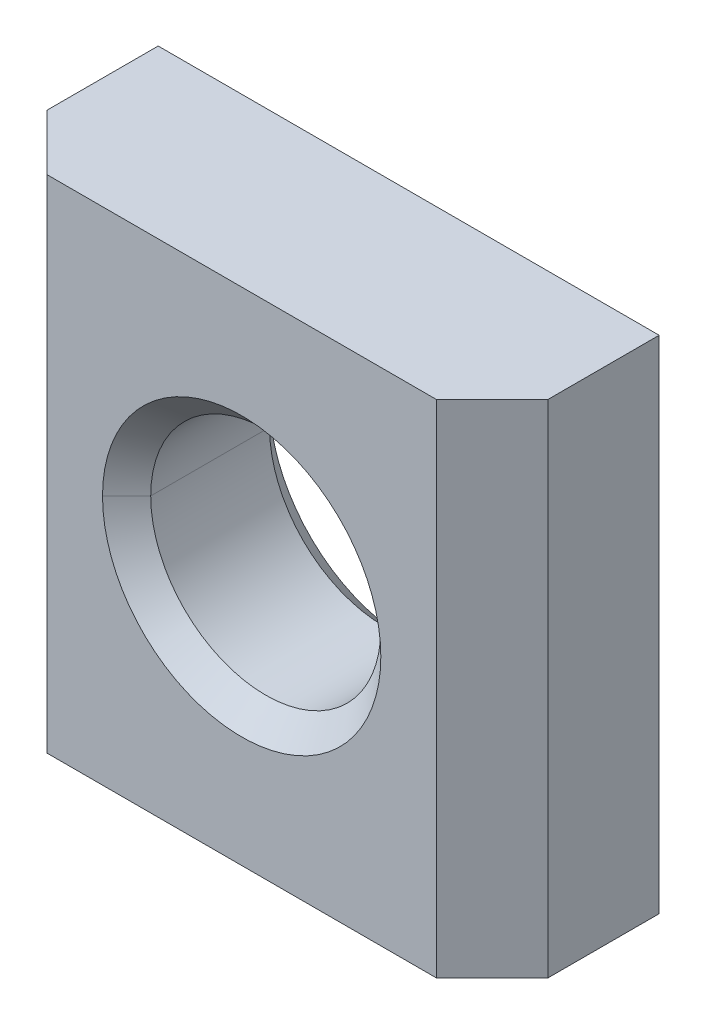
ISO-10303-21;
HEADER;
FILE_DESCRIPTION(('STEP AP214'),'2;1');
FILE_NAME('part.step','',(''),(''),'','','');
FILE_SCHEMA(('AUTOMOTIVE_DESIGN { 1 0 10303 214 1 1 1 1 }'));
ENDSEC;
DATA;
#1=APPLICATION_CONTEXT('core data for automotive mechanical design processes');
#2=APPLICATION_PROTOCOL_DEFINITION('international standard','automotive_design',2000,#1);
#3=PRODUCT_CONTEXT('',#1,'mechanical');
#4=PRODUCT('Part','Part','',(#3));
#5=PRODUCT_RELATED_PRODUCT_CATEGORY('part','',(#4));
#6=PRODUCT_DEFINITION_FORMATION('','',#4);
#7=PRODUCT_DEFINITION_CONTEXT('part definition',#1,'design');
#8=PRODUCT_DEFINITION('design','',#6,#7);
#9=PRODUCT_DEFINITION_SHAPE('','',#8);
#10=(LENGTH_UNIT() NAMED_UNIT(*) SI_UNIT(.MILLI.,.METRE.));
#11=(NAMED_UNIT(*) PLANE_ANGLE_UNIT() SI_UNIT($,.RADIAN.));
#12=(NAMED_UNIT(*) SI_UNIT($,.STERADIAN.) SOLID_ANGLE_UNIT());
#13=UNCERTAINTY_MEASURE_WITH_UNIT(LENGTH_MEASURE(1.E-05),#10,'distance_accuracy_value','');
#14=(GEOMETRIC_REPRESENTATION_CONTEXT(3) GLOBAL_UNCERTAINTY_ASSIGNED_CONTEXT((#13)) GLOBAL_UNIT_ASSIGNED_CONTEXT((#10,
#11,#12)) REPRESENTATION_CONTEXT('',''));
#15=CARTESIAN_POINT('',(0.,0.,0.));
#16=DIRECTION('',(0.,0.,1.));
#17=DIRECTION('',(1.,0.,0.));
#18=AXIS2_PLACEMENT_3D('',#15,#16,#17);
#19=CARTESIAN_POINT('',(4.5,4.5,1.5));
#20=DIRECTION('',(0.,-1.,0.));
#21=DIRECTION('',(0.,0.,-1.));
#22=AXIS2_PLACEMENT_3D('',#19,#20,#21);
#23=PLANE('',#22);
#24=DIRECTION('',(-0.707106781186548,0.,-0.707106781186547));
#25=VECTOR('',#24,1.);
#26=CARTESIAN_POINT('',(0.5,4.5,5.5));
#27=LINE('',#26,#25);
#28=CARTESIAN_POINT('',(-3.5,4.5,1.5));
#29=VERTEX_POINT('',#28);
#30=CARTESIAN_POINT('',(-4.5,4.5,0.5));
#31=VERTEX_POINT('',#30);
#32=EDGE_CURVE('E11',#29,#31,#27,.T.);
#33=ORIENTED_EDGE('',*,*,#32,.F.);
#34=DIRECTION('',(-1.,0.,0.));
#35=VECTOR('',#34,1.);
#36=CARTESIAN_POINT('',(4.5,4.5,1.5));
#37=LINE('',#36,#35);
#38=CARTESIAN_POINT('',(3.5,4.5,1.5));
#39=VERTEX_POINT('',#38);
#40=EDGE_CURVE('E24',#39,#29,#37,.T.);
#41=ORIENTED_EDGE('',*,*,#40,.F.);
#42=DIRECTION('',(-0.707106781186548,0.,0.707106781186547));
#43=VECTOR('',#42,1.);
#44=CARTESIAN_POINT('',(4.,4.5,1.));
#45=LINE('',#44,#43);
#46=CARTESIAN_POINT('',(4.5,4.5,0.5));
#47=VERTEX_POINT('',#46);
#48=EDGE_CURVE('E238',#47,#39,#45,.T.);
#49=ORIENTED_EDGE('',*,*,#48,.F.);
#50=DIRECTION('',(0.,0.,-1.));
#51=VECTOR('',#50,1.);
#52=CARTESIAN_POINT('',(4.5,4.5,1.5));
#53=LINE('',#52,#51);
#54=CARTESIAN_POINT('',(4.5,4.5,-1.5));
#55=VERTEX_POINT('',#54);
#56=EDGE_CURVE('E234',#47,#55,#53,.T.);
#57=ORIENTED_EDGE('',*,*,#56,.T.);
#58=DIRECTION('',(-1.,0.,0.));
#59=VECTOR('',#58,1.);
#60=CARTESIAN_POINT('',(4.5,4.5,-1.5));
#61=LINE('',#60,#59);
#62=CARTESIAN_POINT('',(-4.5,4.5,-1.5));
#63=VERTEX_POINT('',#62);
#64=EDGE_CURVE('E230',#55,#63,#61,.T.);
#65=ORIENTED_EDGE('',*,*,#64,.T.);
#66=DIRECTION('',(0.,0.,-1.));
#67=VECTOR('',#66,1.);
#68=CARTESIAN_POINT('',(-4.5,4.5,1.5));
#69=LINE('',#68,#67);
#70=EDGE_CURVE('E225',#31,#63,#69,.T.);
#71=ORIENTED_EDGE('',*,*,#70,.F.);
#72=EDGE_LOOP('',(#33,#41,#49,#57,#65,#71));
#73=FACE_BOUND('',#72,.T.);
#74=ADVANCED_FACE('F16',(#73),#23,.F.);
#75=CARTESIAN_POINT('',(-4.5,4.5,1.5));
#76=DIRECTION('',(1.,0.,0.));
#77=DIRECTION('',(0.,0.,-1.));
#78=AXIS2_PLACEMENT_3D('',#75,#76,#77);
#79=PLANE('',#78);
#80=DIRECTION('',(0.,-1.,0.));
#81=VECTOR('',#80,1.);
#82=CARTESIAN_POINT('',(-4.5,9.,0.5));
#83=LINE('',#82,#81);
#84=CARTESIAN_POINT('',(-4.5,-4.5,0.5));
#85=VERTEX_POINT('',#84);
#86=EDGE_CURVE('E220',#31,#85,#83,.T.);
#87=ORIENTED_EDGE('',*,*,#86,.F.);
#88=ORIENTED_EDGE('',*,*,#70,.T.);
#89=DIRECTION('',(0.,-1.,0.));
#90=VECTOR('',#89,1.);
#91=CARTESIAN_POINT('',(-4.5,4.5,-1.5));
#92=LINE('',#91,#90);
#93=CARTESIAN_POINT('',(-4.5,-4.5,-1.5));
#94=VERTEX_POINT('',#93);
#95=EDGE_CURVE('E216',#63,#94,#92,.T.);
#96=ORIENTED_EDGE('',*,*,#95,.T.);
#97=DIRECTION('',(0.,0.,-1.));
#98=VECTOR('',#97,1.);
#99=CARTESIAN_POINT('',(-4.5,-4.5,1.5));
#100=LINE('',#99,#98);
#101=EDGE_CURVE('E211',#85,#94,#100,.T.);
#102=ORIENTED_EDGE('',*,*,#101,.F.);
#103=EDGE_LOOP('',(#87,#88,#96,#102));
#104=FACE_BOUND('',#103,.T.);
#105=ADVANCED_FACE('F263',(#104),#79,.F.);
#106=CARTESIAN_POINT('',(-4.5,-4.5,1.5));
#107=DIRECTION('',(0.,1.,0.));
#108=DIRECTION('',(0.,0.,1.));
#109=AXIS2_PLACEMENT_3D('',#106,#107,#108);
#110=PLANE('',#109);
#111=DIRECTION('',(0.707106781186548,0.,0.707106781186547));
#112=VECTOR('',#111,1.);
#113=CARTESIAN_POINT('',(-4.,-4.5,1.));
#114=LINE('',#113,#112);
#115=CARTESIAN_POINT('',(-3.5,-4.5,1.5));
#116=VERTEX_POINT('',#115);
#117=EDGE_CURVE('E206',#85,#116,#114,.T.);
#118=ORIENTED_EDGE('',*,*,#117,.F.);
#119=ORIENTED_EDGE('',*,*,#101,.T.);
#120=DIRECTION('',(1.,0.,0.));
#121=VECTOR('',#120,1.);
#122=CARTESIAN_POINT('',(-4.5,-4.5,-1.5));
#123=LINE('',#122,#121);
#124=CARTESIAN_POINT('',(4.5,-4.5,-1.5));
#125=VERTEX_POINT('',#124);
#126=EDGE_CURVE('E202',#94,#125,#123,.T.);
#127=ORIENTED_EDGE('',*,*,#126,.T.);
#128=DIRECTION('',(0.,0.,-1.));
#129=VECTOR('',#128,1.);
#130=CARTESIAN_POINT('',(4.5,-4.5,1.5));
#131=LINE('',#130,#129);
#132=CARTESIAN_POINT('',(4.5,-4.5,0.5));
#133=VERTEX_POINT('',#132);
#134=EDGE_CURVE('E197',#133,#125,#131,.T.);
#135=ORIENTED_EDGE('',*,*,#134,.F.);
#136=DIRECTION('',(0.707106781186548,0.,-0.707106781186547));
#137=VECTOR('',#136,1.);
#138=CARTESIAN_POINT('',(-0.5,-4.5,5.5));
#139=LINE('',#138,#137);
#140=CARTESIAN_POINT('',(3.5,-4.5,1.5));
#141=VERTEX_POINT('',#140);
#142=EDGE_CURVE('E192',#141,#133,#139,.T.);
#143=ORIENTED_EDGE('',*,*,#142,.F.);
#144=DIRECTION('',(1.,0.,0.));
#145=VECTOR('',#144,1.);
#146=CARTESIAN_POINT('',(-4.5,-4.5,1.5));
#147=LINE('',#146,#145);
#148=EDGE_CURVE('E187',#116,#141,#147,.T.);
#149=ORIENTED_EDGE('',*,*,#148,.F.);
#150=EDGE_LOOP('',(#118,#119,#127,#135,#143,#149));
#151=FACE_BOUND('',#150,.T.);
#152=ADVANCED_FACE('F268',(#151),#110,.F.);
#153=CARTESIAN_POINT('',(0.,0.,1.5));
#154=DIRECTION('',(0.,0.,1.));
#155=DIRECTION('',(1.,0.,0.));
#156=AXIS2_PLACEMENT_3D('',#153,#154,#155);
#157=PLANE('',#156);
#158=CARTESIAN_POINT('',(0.,0.,1.5));
#159=DIRECTION('',(0.,0.,-1.));
#160=DIRECTION('',(-1.,0.,0.));
#161=AXIS2_PLACEMENT_3D('',#158,#159,#160);
#162=CIRCLE('',#161,2.5);
#163=CARTESIAN_POINT('',(-2.5,0.,1.5));
#164=VERTEX_POINT('',#163);
#165=CARTESIAN_POINT('',(2.5,0.,1.5));
#166=VERTEX_POINT('',#165);
#167=EDGE_CURVE('E183',#164,#166,#162,.T.);
#168=ORIENTED_EDGE('',*,*,#167,.T.);
#169=CARTESIAN_POINT('',(0.,0.,1.5));
#170=DIRECTION('',(0.,0.,-1.));
#171=DIRECTION('',(-1.,0.,0.));
#172=AXIS2_PLACEMENT_3D('',#169,#170,#171);
#173=CIRCLE('',#172,2.5);
#174=EDGE_CURVE('E119',#166,#164,#173,.T.);
#175=ORIENTED_EDGE('',*,*,#174,.T.);
#176=EDGE_LOOP('',(#168,#175));
#177=FACE_BOUND('',#176,.T.);
#178=ORIENTED_EDGE('',*,*,#40,.T.);
#179=DIRECTION('',(0.,-1.,0.));
#180=VECTOR('',#179,1.);
#181=CARTESIAN_POINT('',(-3.5,9.,1.5));
#182=LINE('',#181,#180);
#183=EDGE_CURVE('E175',#29,#116,#182,.T.);
#184=ORIENTED_EDGE('',*,*,#183,.T.);
#185=ORIENTED_EDGE('',*,*,#148,.T.);
#186=DIRECTION('',(0.,-1.,0.));
#187=VECTOR('',#186,1.);
#188=CARTESIAN_POINT('',(3.5,9.,1.5));
#189=LINE('',#188,#187);
#190=EDGE_CURVE('E170',#39,#141,#189,.T.);
#191=ORIENTED_EDGE('',*,*,#190,.F.);
#192=EDGE_LOOP('',(#178,#184,#185,#191));
#193=FACE_BOUND('',#192,.T.);
#194=ADVANCED_FACE('F248',(#177,#193),#157,.T.);
#195=CARTESIAN_POINT('',(4.5,9.,0.5));
#196=DIRECTION('',(0.707106781186547,0.,0.707106781186548));
#197=DIRECTION('',(0.707106781186548,0.,-0.707106781186547));
#198=AXIS2_PLACEMENT_3D('',#195,#196,#197);
#199=PLANE('',#198);
#200=ORIENTED_EDGE('',*,*,#48,.T.);
#201=ORIENTED_EDGE('',*,*,#190,.T.);
#202=ORIENTED_EDGE('',*,*,#142,.T.);
#203=DIRECTION('',(0.,-1.,0.));
#204=VECTOR('',#203,1.);
#205=CARTESIAN_POINT('',(4.5,9.,0.5));
#206=LINE('',#205,#204);
#207=EDGE_CURVE('E165',#47,#133,#206,.T.);
#208=ORIENTED_EDGE('',*,*,#207,.F.);
#209=EDGE_LOOP('',(#200,#201,#202,#208));
#210=FACE_BOUND('',#209,.T.);
#211=ADVANCED_FACE('F251',(#210),#199,.T.);
#212=CARTESIAN_POINT('',(4.5,-4.5,1.5));
#213=DIRECTION('',(-1.,0.,0.));
#214=DIRECTION('',(0.,0.,1.));
#215=AXIS2_PLACEMENT_3D('',#212,#213,#214);
#216=PLANE('',#215);
#217=ORIENTED_EDGE('',*,*,#207,.T.);
#218=ORIENTED_EDGE('',*,*,#134,.T.);
#219=DIRECTION('',(0.,1.,0.));
#220=VECTOR('',#219,1.);
#221=CARTESIAN_POINT('',(4.5,-4.5,-1.5));
#222=LINE('',#221,#220);
#223=EDGE_CURVE('E160',#125,#55,#222,.T.);
#224=ORIENTED_EDGE('',*,*,#223,.T.);
#225=ORIENTED_EDGE('',*,*,#56,.F.);
#226=EDGE_LOOP('',(#217,#218,#224,#225));
#227=FACE_BOUND('',#226,.T.);
#228=ADVANCED_FACE('F257',(#227),#216,.F.);
#229=CARTESIAN_POINT('',(0.,0.,-1.5));
#230=DIRECTION('',(0.,0.,1.));
#231=DIRECTION('',(1.,0.,0.));
#232=AXIS2_PLACEMENT_3D('',#229,#230,#231);
#233=PLANE('',#232);
#234=CARTESIAN_POINT('',(0.,0.,-1.5));
#235=DIRECTION('',(0.,0.,-1.));
#236=DIRECTION('',(-1.,0.,0.));
#237=AXIS2_PLACEMENT_3D('',#234,#235,#236);
#238=CIRCLE('',#237,2.5);
#239=CARTESIAN_POINT('',(2.5,0.,-1.5));
#240=VERTEX_POINT('',#239);
#241=CARTESIAN_POINT('',(-2.5,0.,-1.5));
#242=VERTEX_POINT('',#241);
#243=EDGE_CURVE('E155',#240,#242,#238,.T.);
#244=ORIENTED_EDGE('',*,*,#243,.F.);
#245=CARTESIAN_POINT('',(0.,0.,-1.5));
#246=DIRECTION('',(0.,0.,-1.));
#247=DIRECTION('',(-1.,0.,0.));
#248=AXIS2_PLACEMENT_3D('',#245,#246,#247);
#249=CIRCLE('',#248,2.5);
#250=EDGE_CURVE('E150',#242,#240,#249,.T.);
#251=ORIENTED_EDGE('',*,*,#250,.F.);
#252=EDGE_LOOP('',(#244,#251));
#253=FACE_BOUND('',#252,.T.);
#254=ORIENTED_EDGE('',*,*,#64,.F.);
#255=ORIENTED_EDGE('',*,*,#223,.F.);
#256=ORIENTED_EDGE('',*,*,#126,.F.);
#257=ORIENTED_EDGE('',*,*,#95,.F.);
#258=EDGE_LOOP('',(#254,#255,#256,#257));
#259=FACE_BOUND('',#258,.T.);
#260=ADVANCED_FACE('F260',(#253,#259),#233,.F.);
#261=CARTESIAN_POINT('',(0.,0.,-1.067));
#262=DIRECTION('',(0.,0.,-1.));
#263=DIRECTION('',(0.,-1.,0.));
#264=AXIS2_PLACEMENT_3D('',#261,#262,#263);
#265=CONICAL_SURFACE('',#264,2.067,0.785398163397448);
#266=DIRECTION('',(0.707106781186547,0.,-0.707106781186548));
#267=VECTOR('',#266,1.);
#268=CARTESIAN_POINT('',(2.067,0.,-1.067));
#269=LINE('',#268,#267);
#270=CARTESIAN_POINT('',(2.067,0.,-1.067));
#271=VERTEX_POINT('',#270);
#272=EDGE_CURVE('E145',#271,#240,#269,.T.);
#273=ORIENTED_EDGE('',*,*,#272,.F.);
#274=CARTESIAN_POINT('',(0.,0.,-1.067));
#275=DIRECTION('',(0.,0.,-1.));
#276=DIRECTION('',(-1.,0.,0.));
#277=AXIS2_PLACEMENT_3D('',#274,#275,#276);
#278=CIRCLE('',#277,2.067);
#279=CARTESIAN_POINT('',(-2.067,0.,-1.067));
#280=VERTEX_POINT('',#279);
#281=EDGE_CURVE('E108',#280,#271,#278,.T.);
#282=ORIENTED_EDGE('',*,*,#281,.F.);
#283=DIRECTION('',(-0.707106781186547,0.,-0.707106781186548));
#284=VECTOR('',#283,1.);
#285=CARTESIAN_POINT('',(-2.067,0.,-1.067));
#286=LINE('',#285,#284);
#287=EDGE_CURVE('E137',#280,#242,#286,.T.);
#288=ORIENTED_EDGE('',*,*,#287,.T.);
#289=ORIENTED_EDGE('',*,*,#250,.T.);
#290=EDGE_LOOP('',(#273,#282,#288,#289));
#291=FACE_BOUND('',#290,.T.);
#292=ADVANCED_FACE('F331',(#291),#265,.F.);
#293=CARTESIAN_POINT('',(0.,0.,-1.067));
#294=DIRECTION('',(0.,0.,-1.));
#295=DIRECTION('',(0.,1.,0.));
#296=AXIS2_PLACEMENT_3D('',#293,#294,#295);
#297=CONICAL_SURFACE('',#296,2.067,0.785398163397448);
#298=ORIENTED_EDGE('',*,*,#272,.T.);
#299=ORIENTED_EDGE('',*,*,#243,.T.);
#300=ORIENTED_EDGE('',*,*,#287,.F.);
#301=CARTESIAN_POINT('',(0.,0.,-1.067));
#302=DIRECTION('',(0.,0.,-1.));
#303=DIRECTION('',(-1.,0.,0.));
#304=AXIS2_PLACEMENT_3D('',#301,#302,#303);
#305=CIRCLE('',#304,2.067);
#306=EDGE_CURVE('E109',#271,#280,#305,.T.);
#307=ORIENTED_EDGE('',*,*,#306,.F.);
#308=EDGE_LOOP('',(#298,#299,#300,#307));
#309=FACE_BOUND('',#308,.T.);
#310=ADVANCED_FACE('F342',(#309),#297,.F.);
#311=CARTESIAN_POINT('',(0.,0.,-1.5));
#312=DIRECTION('',(0.,0.,-1.));
#313=DIRECTION('',(0.,1.,0.));
#314=AXIS2_PLACEMENT_3D('',#311,#312,#313);
#315=CYLINDRICAL_SURFACE('',#314,2.067);
#316=DIRECTION('',(0.,0.,-1.));
#317=VECTOR('',#316,1.);
#318=CARTESIAN_POINT('',(2.067,0.,1.067));
#319=LINE('',#318,#317);
#320=CARTESIAN_POINT('',(2.067,0.,1.067));
#321=VERTEX_POINT('',#320);
#322=EDGE_CURVE('E93',#321,#271,#319,.T.);
#323=ORIENTED_EDGE('',*,*,#322,.T.);
#324=ORIENTED_EDGE('',*,*,#306,.T.);
#325=DIRECTION('',(0.,0.,-1.));
#326=VECTOR('',#325,1.);
#327=CARTESIAN_POINT('',(-2.067,0.,1.067));
#328=LINE('',#327,#326);
#329=CARTESIAN_POINT('',(-2.067,0.,1.067));
#330=VERTEX_POINT('',#329);
#331=EDGE_CURVE('E96',#330,#280,#328,.T.);
#332=ORIENTED_EDGE('',*,*,#331,.F.);
#333=CARTESIAN_POINT('',(0.,0.,1.067));
#334=DIRECTION('',(0.,0.,-1.));
#335=DIRECTION('',(-1.,0.,0.));
#336=AXIS2_PLACEMENT_3D('',#333,#334,#335);
#337=CIRCLE('',#336,2.067);
#338=EDGE_CURVE('E89',#321,#330,#337,.T.);
#339=ORIENTED_EDGE('',*,*,#338,.F.);
#340=EDGE_LOOP('',(#323,#324,#332,#339));
#341=FACE_BOUND('',#340,.T.);
#342=ADVANCED_FACE('F91',(#341),#315,.F.);
#343=CARTESIAN_POINT('',(0.,0.,1.5));
#344=DIRECTION('',(0.,0.,1.));
#345=DIRECTION('',(0.,1.,0.));
#346=AXIS2_PLACEMENT_3D('',#343,#344,#345);
#347=CONICAL_SURFACE('',#346,2.5,0.785398163397448);
#348=DIRECTION('',(-0.707106781186547,0.,0.707106781186548));
#349=VECTOR('',#348,1.);
#350=CARTESIAN_POINT('',(-2.067,0.,1.067));
#351=LINE('',#350,#349);
#352=EDGE_CURVE('E101',#330,#164,#351,.T.);
#353=ORIENTED_EDGE('',*,*,#352,.T.);
#354=ORIENTED_EDGE('',*,*,#174,.F.);
#355=DIRECTION('',(0.707106781186547,0.,0.707106781186548));
#356=VECTOR('',#355,1.);
#357=CARTESIAN_POINT('',(2.067,0.,1.067));
#358=LINE('',#357,#356);
#359=EDGE_CURVE('E115',#321,#166,#358,.T.);
#360=ORIENTED_EDGE('',*,*,#359,.F.);
#361=ORIENTED_EDGE('',*,*,#338,.T.);
#362=EDGE_LOOP('',(#353,#354,#360,#361));
#363=FACE_BOUND('',#362,.T.);
#364=ADVANCED_FACE('F118',(#363),#347,.F.);
#365=CARTESIAN_POINT('',(0.,0.,1.5));
#366=DIRECTION('',(0.,0.,1.));
#367=DIRECTION('',(0.,-1.,0.));
#368=AXIS2_PLACEMENT_3D('',#365,#366,#367);
#369=CONICAL_SURFACE('',#368,2.5,0.785398163397448);
#370=ORIENTED_EDGE('',*,*,#352,.F.);
#371=CARTESIAN_POINT('',(0.,0.,1.067));
#372=DIRECTION('',(0.,0.,-1.));
#373=DIRECTION('',(-1.,0.,0.));
#374=AXIS2_PLACEMENT_3D('',#371,#372,#373);
#375=CIRCLE('',#374,2.067);
#376=EDGE_CURVE('E106',#330,#321,#375,.T.);
#377=ORIENTED_EDGE('',*,*,#376,.T.);
#378=ORIENTED_EDGE('',*,*,#359,.T.);
#379=ORIENTED_EDGE('',*,*,#167,.F.);
#380=EDGE_LOOP('',(#370,#377,#378,#379));
#381=FACE_BOUND('',#380,.T.);
#382=ADVANCED_FACE('F113',(#381),#369,.F.);
#383=CARTESIAN_POINT('',(0.,0.,-1.5));
#384=DIRECTION('',(0.,0.,-1.));
#385=DIRECTION('',(0.,-1.,0.));
#386=AXIS2_PLACEMENT_3D('',#383,#384,#385);
#387=CYLINDRICAL_SURFACE('',#386,2.067);
#388=ORIENTED_EDGE('',*,*,#322,.F.);
#389=ORIENTED_EDGE('',*,*,#376,.F.);
#390=ORIENTED_EDGE('',*,*,#331,.T.);
#391=ORIENTED_EDGE('',*,*,#281,.T.);
#392=EDGE_LOOP('',(#388,#389,#390,#391));
#393=FACE_BOUND('',#392,.T.);
#394=ADVANCED_FACE('F105',(#393),#387,.F.);
#395=CARTESIAN_POINT('',(-3.5,9.,1.5));
#396=DIRECTION('',(-0.707106781186547,0.,0.707106781186548));
#397=DIRECTION('',(0.707106781186548,0.,0.707106781186547));
#398=AXIS2_PLACEMENT_3D('',#395,#396,#397);
#399=PLANE('',#398);
#400=ORIENTED_EDGE('',*,*,#32,.T.);
#401=ORIENTED_EDGE('',*,*,#86,.T.);
#402=ORIENTED_EDGE('',*,*,#117,.T.);
#403=ORIENTED_EDGE('',*,*,#183,.F.);
#404=EDGE_LOOP('',(#400,#401,#402,#403));
#405=FACE_BOUND('',#404,.T.);
#406=ADVANCED_FACE('F266',(#405),#399,.T.);
#407=CLOSED_SHELL('',(#74,#105,#152,#194,#211,#228,#260,#292,#310,#342,#364,#382,#394,#406));
#408=MANIFOLD_SOLID_BREP('B1',#407);
#409=ADVANCED_BREP_SHAPE_REPRESENTATION('',(#18,#408),#14);
#410=SHAPE_DEFINITION_REPRESENTATION(#9,#409);
ENDSEC;
END-ISO-10303-21;
